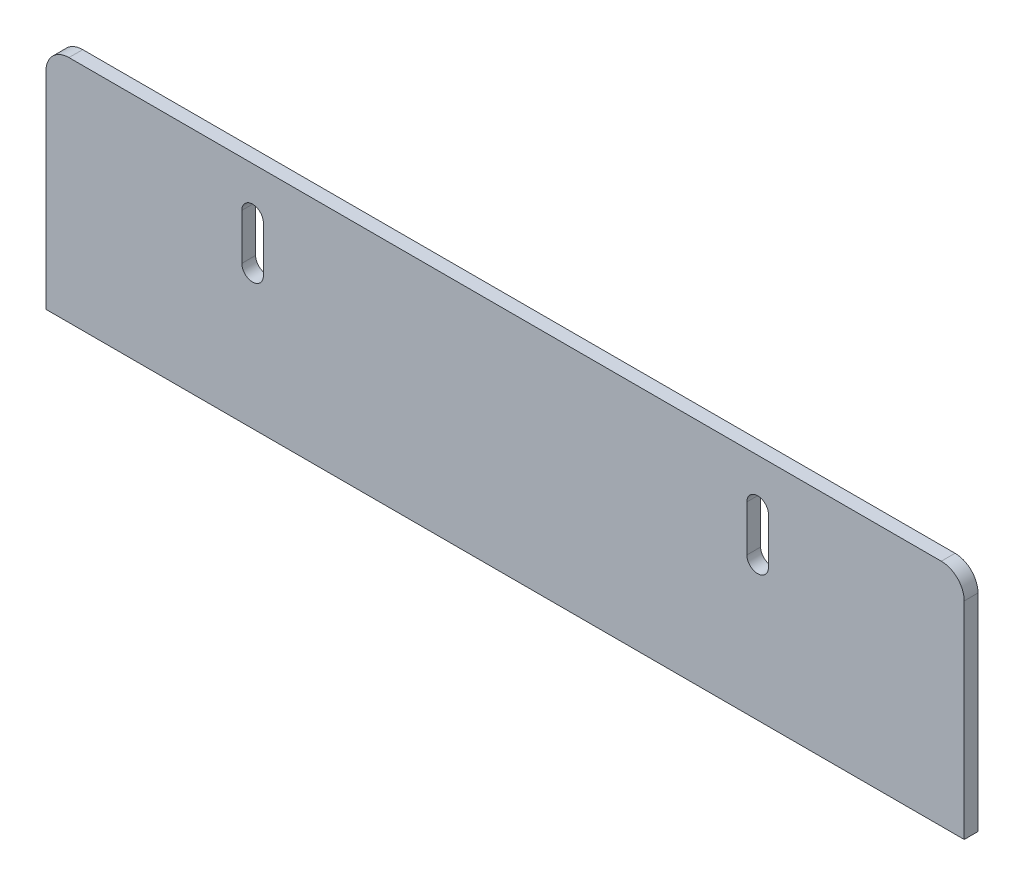
ISO-10303-21;
HEADER;
FILE_DESCRIPTION(('STEP AP214'),'2;1');
FILE_NAME('part.step','',(''),(''),'','','');
FILE_SCHEMA(('AUTOMOTIVE_DESIGN { 1 0 10303 214 1 1 1 1 }'));
ENDSEC;
DATA;
#1=APPLICATION_CONTEXT('core data for automotive mechanical design processes');
#2=APPLICATION_PROTOCOL_DEFINITION('international standard','automotive_design',2000,#1);
#3=PRODUCT_CONTEXT('',#1,'mechanical');
#4=PRODUCT('Part','Part','',(#3));
#5=PRODUCT_RELATED_PRODUCT_CATEGORY('part','',(#4));
#6=PRODUCT_DEFINITION_FORMATION('','',#4);
#7=PRODUCT_DEFINITION_CONTEXT('part definition',#1,'design');
#8=PRODUCT_DEFINITION('design','',#6,#7);
#9=PRODUCT_DEFINITION_SHAPE('','',#8);
#10=(LENGTH_UNIT() NAMED_UNIT(*) SI_UNIT(.MILLI.,.METRE.));
#11=(NAMED_UNIT(*) PLANE_ANGLE_UNIT() SI_UNIT($,.RADIAN.));
#12=(NAMED_UNIT(*) SI_UNIT($,.STERADIAN.) SOLID_ANGLE_UNIT());
#13=UNCERTAINTY_MEASURE_WITH_UNIT(LENGTH_MEASURE(1.E-05),#10,'distance_accuracy_value','');
#14=(GEOMETRIC_REPRESENTATION_CONTEXT(3) GLOBAL_UNCERTAINTY_ASSIGNED_CONTEXT((#13)) GLOBAL_UNIT_ASSIGNED_CONTEXT((#10,
#11,#12)) REPRESENTATION_CONTEXT('',''));
#15=CARTESIAN_POINT('',(0.,0.,0.));
#16=DIRECTION('',(0.,0.,1.));
#17=DIRECTION('',(1.,0.,0.));
#18=AXIS2_PLACEMENT_3D('',#15,#16,#17);
#19=CARTESIAN_POINT('',(45.,30.,3.));
#20=DIRECTION('',(0.,0.,-1.));
#21=DIRECTION('',(-1.,0.,0.));
#22=AXIS2_PLACEMENT_3D('',#19,#20,#21);
#23=CYLINDRICAL_SURFACE('',#22,2.35101433519541);
#24=CARTESIAN_POINT('',(45.,30.,0.));
#25=DIRECTION('',(0.,0.,1.));
#26=DIRECTION('',(1.,0.,0.));
#27=AXIS2_PLACEMENT_3D('',#24,#25,#26);
#28=CIRCLE('',#27,2.35101433519541);
#29=CARTESIAN_POINT('',(42.6489856648046,30.,0.));
#30=VERTEX_POINT('',#29);
#31=CARTESIAN_POINT('',(47.3510143351954,30.,0.));
#32=VERTEX_POINT('',#31);
#33=EDGE_CURVE('E197',#30,#32,#28,.T.);
#34=ORIENTED_EDGE('',*,*,#33,.F.);
#35=DIRECTION('',(0.,0.,-1.));
#36=VECTOR('',#35,1.);
#37=CARTESIAN_POINT('',(42.6489856648046,30.,3.));
#38=LINE('',#37,#36);
#39=CARTESIAN_POINT('',(42.6489856648046,30.,3.));
#40=VERTEX_POINT('',#39);
#41=EDGE_CURVE('E11',#40,#30,#38,.T.);
#42=ORIENTED_EDGE('',*,*,#41,.F.);
#43=CARTESIAN_POINT('',(45.,30.,3.));
#44=DIRECTION('',(0.,0.,1.));
#45=DIRECTION('',(1.,0.,0.));
#46=AXIS2_PLACEMENT_3D('',#43,#44,#45);
#47=CIRCLE('',#46,2.35101433519541);
#48=CARTESIAN_POINT('',(47.3510143351954,30.,3.));
#49=VERTEX_POINT('',#48);
#50=EDGE_CURVE('E161',#40,#49,#47,.T.);
#51=ORIENTED_EDGE('',*,*,#50,.T.);
#52=DIRECTION('',(0.,0.,-1.));
#53=VECTOR('',#52,1.);
#54=CARTESIAN_POINT('',(47.3510143351954,30.,3.));
#55=LINE('',#54,#53);
#56=EDGE_CURVE('E108',#49,#32,#55,.T.);
#57=ORIENTED_EDGE('',*,*,#56,.T.);
#58=EDGE_LOOP('',(#34,#42,#51,#57));
#59=FACE_BOUND('',#58,.T.);
#60=ADVANCED_FACE('F37',(#59),#23,.F.);
#61=CARTESIAN_POINT('',(42.6489856648046,0.,3.));
#62=DIRECTION('',(1.,0.,0.));
#63=DIRECTION('',(0.,0.,-1.));
#64=AXIS2_PLACEMENT_3D('',#61,#62,#63);
#65=PLANE('',#64);
#66=DIRECTION('',(0.,-1.,0.));
#67=VECTOR('',#66,1.);
#68=CARTESIAN_POINT('',(42.6489856648046,0.,0.));
#69=LINE('',#68,#67);
#70=CARTESIAN_POINT('',(42.6489856648046,40.,0.));
#71=VERTEX_POINT('',#70);
#72=EDGE_CURVE('E153',#71,#30,#69,.T.);
#73=ORIENTED_EDGE('',*,*,#72,.F.);
#74=DIRECTION('',(0.,0.,-1.));
#75=VECTOR('',#74,1.);
#76=CARTESIAN_POINT('',(42.6489856648046,40.,3.));
#77=LINE('',#76,#75);
#78=CARTESIAN_POINT('',(42.6489856648046,40.,3.));
#79=VERTEX_POINT('',#78);
#80=EDGE_CURVE('E47',#79,#71,#77,.T.);
#81=ORIENTED_EDGE('',*,*,#80,.F.);
#82=DIRECTION('',(0.,-1.,0.));
#83=VECTOR('',#82,1.);
#84=CARTESIAN_POINT('',(42.6489856648046,0.,3.));
#85=LINE('',#84,#83);
#86=EDGE_CURVE('E151',#79,#40,#85,.T.);
#87=ORIENTED_EDGE('',*,*,#86,.T.);
#88=ORIENTED_EDGE('',*,*,#41,.T.);
#89=EDGE_LOOP('',(#73,#81,#87,#88));
#90=FACE_BOUND('',#89,.T.);
#91=ADVANCED_FACE('F150',(#90),#65,.T.);
#92=CARTESIAN_POINT('',(45.,40.,3.));
#93=DIRECTION('',(0.,0.,-1.));
#94=DIRECTION('',(-1.,0.,0.));
#95=AXIS2_PLACEMENT_3D('',#92,#93,#94);
#96=CYLINDRICAL_SURFACE('',#95,2.35101433519541);
#97=CARTESIAN_POINT('',(45.,40.,0.));
#98=DIRECTION('',(0.,0.,1.));
#99=DIRECTION('',(1.,0.,0.));
#100=AXIS2_PLACEMENT_3D('',#97,#98,#99);
#101=CIRCLE('',#100,2.35101433519541);
#102=CARTESIAN_POINT('',(47.3510143351954,40.,0.));
#103=VERTEX_POINT('',#102);
#104=EDGE_CURVE('E201',#103,#71,#101,.T.);
#105=ORIENTED_EDGE('',*,*,#104,.F.);
#106=DIRECTION('',(0.,0.,-1.));
#107=VECTOR('',#106,1.);
#108=CARTESIAN_POINT('',(47.3510143351954,40.,3.));
#109=LINE('',#108,#107);
#110=CARTESIAN_POINT('',(47.3510143351954,40.,3.));
#111=VERTEX_POINT('',#110);
#112=EDGE_CURVE('E101',#111,#103,#109,.T.);
#113=ORIENTED_EDGE('',*,*,#112,.F.);
#114=CARTESIAN_POINT('',(45.,40.,3.));
#115=DIRECTION('',(0.,0.,1.));
#116=DIRECTION('',(1.,0.,0.));
#117=AXIS2_PLACEMENT_3D('',#114,#115,#116);
#118=CIRCLE('',#117,2.35101433519541);
#119=EDGE_CURVE('E160',#111,#79,#118,.T.);
#120=ORIENTED_EDGE('',*,*,#119,.T.);
#121=ORIENTED_EDGE('',*,*,#80,.T.);
#122=EDGE_LOOP('',(#105,#113,#120,#121));
#123=FACE_BOUND('',#122,.T.);
#124=ADVANCED_FACE('F163',(#123),#96,.F.);
#125=CARTESIAN_POINT('',(0.,50.,3.));
#126=DIRECTION('',(0.,1.,0.));
#127=DIRECTION('',(-1.,0.,0.));
#128=AXIS2_PLACEMENT_3D('',#125,#126,#127);
#129=PLANE('',#128);
#130=DIRECTION('',(1.,0.,0.));
#131=VECTOR('',#130,1.);
#132=CARTESIAN_POINT('',(0.,50.,0.));
#133=LINE('',#132,#131);
#134=CARTESIAN_POINT('',(4.99999999999998,50.,0.));
#135=VERTEX_POINT('',#134);
#136=CARTESIAN_POINT('',(195.,50.,0.));
#137=VERTEX_POINT('',#136);
#138=EDGE_CURVE('E179',#135,#137,#133,.T.);
#139=ORIENTED_EDGE('',*,*,#138,.F.);
#140=DIRECTION('',(0.,0.,-1.));
#141=VECTOR('',#140,1.);
#142=CARTESIAN_POINT('',(4.99999999999998,50.,3.));
#143=LINE('',#142,#141);
#144=CARTESIAN_POINT('',(4.99999999999998,50.,3.));
#145=VERTEX_POINT('',#144);
#146=EDGE_CURVE('E207',#145,#135,#143,.T.);
#147=ORIENTED_EDGE('',*,*,#146,.F.);
#148=DIRECTION('',(1.,0.,0.));
#149=VECTOR('',#148,1.);
#150=CARTESIAN_POINT('',(0.,50.,3.));
#151=LINE('',#150,#149);
#152=CARTESIAN_POINT('',(195.,50.,3.));
#153=VERTEX_POINT('',#152);
#154=EDGE_CURVE('E250',#145,#153,#151,.T.);
#155=ORIENTED_EDGE('',*,*,#154,.T.);
#156=DIRECTION('',(0.,0.,-1.));
#157=VECTOR('',#156,1.);
#158=CARTESIAN_POINT('',(195.,50.,3.));
#159=LINE('',#158,#157);
#160=EDGE_CURVE('E209',#153,#137,#159,.T.);
#161=ORIENTED_EDGE('',*,*,#160,.T.);
#162=EDGE_LOOP('',(#139,#147,#155,#161));
#163=FACE_BOUND('',#162,.T.);
#164=ADVANCED_FACE('F308',(#163),#129,.T.);
#165=CARTESIAN_POINT('',(4.99999999999998,45.,3.));
#166=DIRECTION('',(0.,0.,-1.));
#167=DIRECTION('',(-1.,0.,0.));
#168=AXIS2_PLACEMENT_3D('',#165,#166,#167);
#169=CYLINDRICAL_SURFACE('',#168,4.99999999999999);
#170=CARTESIAN_POINT('',(4.99999999999998,45.,0.));
#171=DIRECTION('',(0.,0.,1.));
#172=DIRECTION('',(1.,0.,0.));
#173=AXIS2_PLACEMENT_3D('',#170,#171,#172);
#174=CIRCLE('',#173,4.99999999999999);
#175=CARTESIAN_POINT('',(0.,45.,0.));
#176=VERTEX_POINT('',#175);
#177=EDGE_CURVE('E182',#176,#135,#174,.F.);
#178=ORIENTED_EDGE('',*,*,#177,.F.);
#179=DIRECTION('',(0.,0.,-1.));
#180=VECTOR('',#179,1.);
#181=CARTESIAN_POINT('',(0.,45.,3.));
#182=LINE('',#181,#180);
#183=CARTESIAN_POINT('',(0.,45.,3.));
#184=VERTEX_POINT('',#183);
#185=EDGE_CURVE('E219',#184,#176,#182,.T.);
#186=ORIENTED_EDGE('',*,*,#185,.F.);
#187=CARTESIAN_POINT('',(4.99999999999998,45.,3.));
#188=DIRECTION('',(0.,0.,1.));
#189=DIRECTION('',(1.,0.,0.));
#190=AXIS2_PLACEMENT_3D('',#187,#188,#189);
#191=CIRCLE('',#190,4.99999999999999);
#192=EDGE_CURVE('E257',#184,#145,#191,.F.);
#193=ORIENTED_EDGE('',*,*,#192,.T.);
#194=ORIENTED_EDGE('',*,*,#146,.T.);
#195=EDGE_LOOP('',(#178,#186,#193,#194));
#196=FACE_BOUND('',#195,.T.);
#197=ADVANCED_FACE('F304',(#196),#169,.T.);
#198=CARTESIAN_POINT('',(0.,0.,3.));
#199=DIRECTION('',(-1.,0.,0.));
#200=DIRECTION('',(0.,0.,1.));
#201=AXIS2_PLACEMENT_3D('',#198,#199,#200);
#202=PLANE('',#201);
#203=DIRECTION('',(0.,1.,0.));
#204=VECTOR('',#203,1.);
#205=CARTESIAN_POINT('',(0.,0.,0.));
#206=LINE('',#205,#204);
#207=CARTESIAN_POINT('',(0.,0.,0.));
#208=VERTEX_POINT('',#207);
#209=EDGE_CURVE('E185',#208,#176,#206,.T.);
#210=ORIENTED_EDGE('',*,*,#209,.F.);
#211=DIRECTION('',(0.,0.,-1.));
#212=VECTOR('',#211,1.);
#213=CARTESIAN_POINT('',(0.,0.,3.));
#214=LINE('',#213,#212);
#215=CARTESIAN_POINT('',(0.,0.,3.));
#216=VERTEX_POINT('',#215);
#217=EDGE_CURVE('E217',#216,#208,#214,.T.);
#218=ORIENTED_EDGE('',*,*,#217,.F.);
#219=DIRECTION('',(0.,1.,0.));
#220=VECTOR('',#219,1.);
#221=CARTESIAN_POINT('',(0.,0.,3.));
#222=LINE('',#221,#220);
#223=EDGE_CURVE('E260',#216,#184,#222,.T.);
#224=ORIENTED_EDGE('',*,*,#223,.T.);
#225=ORIENTED_EDGE('',*,*,#185,.T.);
#226=EDGE_LOOP('',(#210,#218,#224,#225));
#227=FACE_BOUND('',#226,.T.);
#228=ADVANCED_FACE('F300',(#227),#202,.T.);
#229=CARTESIAN_POINT('',(0.,0.,3.));
#230=DIRECTION('',(0.,1.,0.));
#231=DIRECTION('',(-1.,0.,0.));
#232=AXIS2_PLACEMENT_3D('',#229,#230,#231);
#233=PLANE('',#232);
#234=DIRECTION('',(1.,0.,0.));
#235=VECTOR('',#234,1.);
#236=CARTESIAN_POINT('',(0.,0.,0.));
#237=LINE('',#236,#235);
#238=CARTESIAN_POINT('',(200.,0.,0.));
#239=VERTEX_POINT('',#238);
#240=EDGE_CURVE('E188',#208,#239,#237,.T.);
#241=ORIENTED_EDGE('',*,*,#240,.T.);
#242=DIRECTION('',(0.,0.,-1.));
#243=VECTOR('',#242,1.);
#244=CARTESIAN_POINT('',(200.,0.,3.));
#245=LINE('',#244,#243);
#246=CARTESIAN_POINT('',(200.,0.,3.));
#247=VERTEX_POINT('',#246);
#248=EDGE_CURVE('E214',#247,#239,#245,.T.);
#249=ORIENTED_EDGE('',*,*,#248,.F.);
#250=DIRECTION('',(1.,0.,0.));
#251=VECTOR('',#250,1.);
#252=CARTESIAN_POINT('',(0.,0.,3.));
#253=LINE('',#252,#251);
#254=EDGE_CURVE('E263',#216,#247,#253,.T.);
#255=ORIENTED_EDGE('',*,*,#254,.F.);
#256=ORIENTED_EDGE('',*,*,#217,.T.);
#257=EDGE_LOOP('',(#241,#249,#255,#256));
#258=FACE_BOUND('',#257,.T.);
#259=ADVANCED_FACE('F296',(#258),#233,.F.);
#260=CARTESIAN_POINT('',(200.,1.2335811384724E-13,3.));
#261=DIRECTION('',(-1.,0.,0.));
#262=DIRECTION('',(0.,-1.,0.));
#263=AXIS2_PLACEMENT_3D('',#260,#261,#262);
#264=PLANE('',#263);
#265=DIRECTION('',(0.,1.,0.));
#266=VECTOR('',#265,1.);
#267=CARTESIAN_POINT('',(200.,1.2335811384724E-13,0.));
#268=LINE('',#267,#266);
#269=CARTESIAN_POINT('',(200.,45.,0.));
#270=VERTEX_POINT('',#269);
#271=EDGE_CURVE('E191',#239,#270,#268,.T.);
#272=ORIENTED_EDGE('',*,*,#271,.T.);
#273=DIRECTION('',(0.,0.,-1.));
#274=VECTOR('',#273,1.);
#275=CARTESIAN_POINT('',(200.,45.,3.));
#276=LINE('',#275,#274);
#277=CARTESIAN_POINT('',(200.,45.,3.));
#278=VERTEX_POINT('',#277);
#279=EDGE_CURVE('E211',#278,#270,#276,.T.);
#280=ORIENTED_EDGE('',*,*,#279,.F.);
#281=DIRECTION('',(0.,1.,0.));
#282=VECTOR('',#281,1.);
#283=CARTESIAN_POINT('',(200.,1.2335811384724E-13,3.));
#284=LINE('',#283,#282);
#285=EDGE_CURVE('E266',#247,#278,#284,.T.);
#286=ORIENTED_EDGE('',*,*,#285,.F.);
#287=ORIENTED_EDGE('',*,*,#248,.T.);
#288=EDGE_LOOP('',(#272,#280,#286,#287));
#289=FACE_BOUND('',#288,.T.);
#290=ADVANCED_FACE('F293',(#289),#264,.F.);
#291=CARTESIAN_POINT('',(152.648985664805,4.23686046426854E-13,3.));
#292=DIRECTION('',(1.,0.,0.));
#293=DIRECTION('',(0.,1.,0.));
#294=AXIS2_PLACEMENT_3D('',#291,#292,#293);
#295=PLANE('',#294);
#296=DIRECTION('',(0.,-1.,0.));
#297=VECTOR('',#296,1.);
#298=CARTESIAN_POINT('',(152.648985664805,4.23686046426854E-13,0.));
#299=LINE('',#298,#297);
#300=CARTESIAN_POINT('',(152.648985664805,40.,0.));
#301=VERTEX_POINT('',#300);
#302=CARTESIAN_POINT('',(152.648985664805,30.,0.));
#303=VERTEX_POINT('',#302);
#304=EDGE_CURVE('E169',#301,#303,#299,.T.);
#305=ORIENTED_EDGE('',*,*,#304,.F.);
#306=DIRECTION('',(0.,0.,-1.));
#307=VECTOR('',#306,1.);
#308=CARTESIAN_POINT('',(152.648985664805,40.,3.));
#309=LINE('',#308,#307);
#310=CARTESIAN_POINT('',(152.648985664805,40.,3.));
#311=VERTEX_POINT('',#310);
#312=EDGE_CURVE('E41',#311,#301,#309,.T.);
#313=ORIENTED_EDGE('',*,*,#312,.F.);
#314=DIRECTION('',(0.,-1.,0.));
#315=VECTOR('',#314,1.);
#316=CARTESIAN_POINT('',(152.648985664805,4.23686046426854E-13,3.));
#317=LINE('',#316,#315);
#318=CARTESIAN_POINT('',(152.648985664805,30.,3.));
#319=VERTEX_POINT('',#318);
#320=EDGE_CURVE('E205',#311,#319,#317,.T.);
#321=ORIENTED_EDGE('',*,*,#320,.T.);
#322=DIRECTION('',(0.,0.,-1.));
#323=VECTOR('',#322,1.);
#324=CARTESIAN_POINT('',(152.648985664805,30.,3.));
#325=LINE('',#324,#323);
#326=EDGE_CURVE('E165',#319,#303,#325,.T.);
#327=ORIENTED_EDGE('',*,*,#326,.T.);
#328=EDGE_LOOP('',(#305,#313,#321,#327));
#329=FACE_BOUND('',#328,.T.);
#330=ADVANCED_FACE('F39',(#329),#295,.T.);
#331=CARTESIAN_POINT('',(155.,40.,3.));
#332=DIRECTION('',(0.,0.,-1.));
#333=DIRECTION('',(-1.,0.,0.));
#334=AXIS2_PLACEMENT_3D('',#331,#332,#333);
#335=CYLINDRICAL_SURFACE('',#334,2.35101433519541);
#336=CARTESIAN_POINT('',(155.,40.,0.));
#337=DIRECTION('',(0.,0.,1.));
#338=DIRECTION('',(1.,0.,0.));
#339=AXIS2_PLACEMENT_3D('',#336,#337,#338);
#340=CIRCLE('',#339,2.35101433519541);
#341=CARTESIAN_POINT('',(157.351014335195,40.,0.));
#342=VERTEX_POINT('',#341);
#343=EDGE_CURVE('E172',#301,#342,#340,.F.);
#344=ORIENTED_EDGE('',*,*,#343,.T.);
#345=DIRECTION('',(0.,0.,-1.));
#346=VECTOR('',#345,1.);
#347=CARTESIAN_POINT('',(157.351014335195,40.,3.));
#348=LINE('',#347,#346);
#349=CARTESIAN_POINT('',(157.351014335195,40.,3.));
#350=VERTEX_POINT('',#349);
#351=EDGE_CURVE('E225',#350,#342,#348,.T.);
#352=ORIENTED_EDGE('',*,*,#351,.F.);
#353=CARTESIAN_POINT('',(155.,40.,3.));
#354=DIRECTION('',(0.,0.,1.));
#355=DIRECTION('',(1.,0.,0.));
#356=AXIS2_PLACEMENT_3D('',#353,#354,#355);
#357=CIRCLE('',#356,2.35101433519541);
#358=EDGE_CURVE('E234',#311,#350,#357,.F.);
#359=ORIENTED_EDGE('',*,*,#358,.F.);
#360=ORIENTED_EDGE('',*,*,#312,.T.);
#361=EDGE_LOOP('',(#344,#352,#359,#360));
#362=FACE_BOUND('',#361,.T.);
#363=ADVANCED_FACE('F233',(#362),#335,.F.);
#364=CARTESIAN_POINT('',(157.351014335195,4.36736797657643E-13,3.));
#365=DIRECTION('',(1.,0.,0.));
#366=DIRECTION('',(0.,1.,0.));
#367=AXIS2_PLACEMENT_3D('',#364,#365,#366);
#368=PLANE('',#367);
#369=DIRECTION('',(0.,-1.,0.));
#370=VECTOR('',#369,1.);
#371=CARTESIAN_POINT('',(157.351014335195,4.36736797657643E-13,0.));
#372=LINE('',#371,#370);
#373=CARTESIAN_POINT('',(157.351014335195,30.,0.));
#374=VERTEX_POINT('',#373);
#375=EDGE_CURVE('E174',#342,#374,#372,.T.);
#376=ORIENTED_EDGE('',*,*,#375,.T.);
#377=DIRECTION('',(0.,0.,-1.));
#378=VECTOR('',#377,1.);
#379=CARTESIAN_POINT('',(157.351014335195,30.,3.));
#380=LINE('',#379,#378);
#381=CARTESIAN_POINT('',(157.351014335195,30.,3.));
#382=VERTEX_POINT('',#381);
#383=EDGE_CURVE('E223',#382,#374,#380,.T.);
#384=ORIENTED_EDGE('',*,*,#383,.F.);
#385=DIRECTION('',(0.,-1.,0.));
#386=VECTOR('',#385,1.);
#387=CARTESIAN_POINT('',(157.351014335195,4.36736797657643E-13,3.));
#388=LINE('',#387,#386);
#389=EDGE_CURVE('E247',#350,#382,#388,.T.);
#390=ORIENTED_EDGE('',*,*,#389,.F.);
#391=ORIENTED_EDGE('',*,*,#351,.T.);
#392=EDGE_LOOP('',(#376,#384,#390,#391));
#393=FACE_BOUND('',#392,.T.);
#394=ADVANCED_FACE('F246',(#393),#368,.F.);
#395=CARTESIAN_POINT('',(195.,45.,3.));
#396=DIRECTION('',(0.,0.,-1.));
#397=DIRECTION('',(-1.,0.,0.));
#398=AXIS2_PLACEMENT_3D('',#395,#396,#397);
#399=CYLINDRICAL_SURFACE('',#398,4.99999999999999);
#400=CARTESIAN_POINT('',(195.,45.,0.));
#401=DIRECTION('',(0.,0.,1.));
#402=DIRECTION('',(1.,0.,0.));
#403=AXIS2_PLACEMENT_3D('',#400,#401,#402);
#404=CIRCLE('',#403,4.99999999999999);
#405=EDGE_CURVE('E194',#270,#137,#404,.T.);
#406=ORIENTED_EDGE('',*,*,#405,.T.);
#407=ORIENTED_EDGE('',*,*,#160,.F.);
#408=CARTESIAN_POINT('',(195.,45.,3.));
#409=DIRECTION('',(0.,0.,1.));
#410=DIRECTION('',(1.,0.,0.));
#411=AXIS2_PLACEMENT_3D('',#408,#409,#410);
#412=CIRCLE('',#411,4.99999999999999);
#413=EDGE_CURVE('E269',#278,#153,#412,.T.);
#414=ORIENTED_EDGE('',*,*,#413,.F.);
#415=ORIENTED_EDGE('',*,*,#279,.T.);
#416=EDGE_LOOP('',(#406,#407,#414,#415));
#417=FACE_BOUND('',#416,.T.);
#418=ADVANCED_FACE('F279',(#417),#399,.T.);
#419=CARTESIAN_POINT('',(155.,30.,3.));
#420=DIRECTION('',(0.,0.,-1.));
#421=DIRECTION('',(-1.,0.,0.));
#422=AXIS2_PLACEMENT_3D('',#419,#420,#421);
#423=CYLINDRICAL_SURFACE('',#422,2.35101433519541);
#424=CARTESIAN_POINT('',(155.,30.,0.));
#425=DIRECTION('',(0.,0.,1.));
#426=DIRECTION('',(1.,0.,0.));
#427=AXIS2_PLACEMENT_3D('',#424,#425,#426);
#428=CIRCLE('',#427,2.35101433519541);
#429=EDGE_CURVE('E176',#374,#303,#428,.F.);
#430=ORIENTED_EDGE('',*,*,#429,.T.);
#431=ORIENTED_EDGE('',*,*,#326,.F.);
#432=CARTESIAN_POINT('',(155.,30.,3.));
#433=DIRECTION('',(0.,0.,1.));
#434=DIRECTION('',(1.,0.,0.));
#435=AXIS2_PLACEMENT_3D('',#432,#433,#434);
#436=CIRCLE('',#435,2.35101433519541);
#437=EDGE_CURVE('E245',#382,#319,#436,.F.);
#438=ORIENTED_EDGE('',*,*,#437,.F.);
#439=ORIENTED_EDGE('',*,*,#383,.T.);
#440=EDGE_LOOP('',(#430,#431,#438,#439));
#441=FACE_BOUND('',#440,.T.);
#442=ADVANCED_FACE('F243',(#441),#423,.F.);
#443=CARTESIAN_POINT('',(47.3510143351954,0.,3.));
#444=DIRECTION('',(1.,0.,0.));
#445=DIRECTION('',(0.,0.,-1.));
#446=AXIS2_PLACEMENT_3D('',#443,#444,#445);
#447=PLANE('',#446);
#448=DIRECTION('',(0.,-1.,0.));
#449=VECTOR('',#448,1.);
#450=CARTESIAN_POINT('',(47.3510143351954,0.,0.));
#451=LINE('',#450,#449);
#452=EDGE_CURVE('E203',#103,#32,#451,.T.);
#453=ORIENTED_EDGE('',*,*,#452,.T.);
#454=ORIENTED_EDGE('',*,*,#56,.F.);
#455=DIRECTION('',(0.,-1.,0.));
#456=VECTOR('',#455,1.);
#457=CARTESIAN_POINT('',(47.3510143351954,0.,3.));
#458=LINE('',#457,#456);
#459=EDGE_CURVE('E56',#111,#49,#458,.T.);
#460=ORIENTED_EDGE('',*,*,#459,.F.);
#461=ORIENTED_EDGE('',*,*,#112,.T.);
#462=EDGE_LOOP('',(#453,#454,#460,#461));
#463=FACE_BOUND('',#462,.T.);
#464=ADVANCED_FACE('F271',(#463),#447,.F.);
#465=CARTESIAN_POINT('',(0.,0.,3.));
#466=DIRECTION('',(0.,0.,1.));
#467=DIRECTION('',(1.,0.,0.));
#468=AXIS2_PLACEMENT_3D('',#465,#466,#467);
#469=PLANE('',#468);
#470=ORIENTED_EDGE('',*,*,#320,.F.);
#471=ORIENTED_EDGE('',*,*,#358,.T.);
#472=ORIENTED_EDGE('',*,*,#389,.T.);
#473=ORIENTED_EDGE('',*,*,#437,.T.);
#474=EDGE_LOOP('',(#470,#471,#472,#473));
#475=FACE_BOUND('',#474,.T.);
#476=ORIENTED_EDGE('',*,*,#154,.F.);
#477=ORIENTED_EDGE('',*,*,#192,.F.);
#478=ORIENTED_EDGE('',*,*,#223,.F.);
#479=ORIENTED_EDGE('',*,*,#254,.T.);
#480=ORIENTED_EDGE('',*,*,#285,.T.);
#481=ORIENTED_EDGE('',*,*,#413,.T.);
#482=EDGE_LOOP('',(#476,#477,#478,#479,#480,#481));
#483=FACE_BOUND('',#482,.T.);
#484=ORIENTED_EDGE('',*,*,#50,.F.);
#485=ORIENTED_EDGE('',*,*,#86,.F.);
#486=ORIENTED_EDGE('',*,*,#119,.F.);
#487=ORIENTED_EDGE('',*,*,#459,.T.);
#488=EDGE_LOOP('',(#484,#485,#486,#487));
#489=FACE_BOUND('',#488,.T.);
#490=ADVANCED_FACE('F159',(#475,#483,#489),#469,.T.);
#491=CARTESIAN_POINT('',(0.,0.,0.));
#492=DIRECTION('',(0.,0.,1.));
#493=DIRECTION('',(1.,0.,0.));
#494=AXIS2_PLACEMENT_3D('',#491,#492,#493);
#495=PLANE('',#494);
#496=ORIENTED_EDGE('',*,*,#304,.T.);
#497=ORIENTED_EDGE('',*,*,#429,.F.);
#498=ORIENTED_EDGE('',*,*,#375,.F.);
#499=ORIENTED_EDGE('',*,*,#343,.F.);
#500=EDGE_LOOP('',(#496,#497,#498,#499));
#501=FACE_BOUND('',#500,.T.);
#502=ORIENTED_EDGE('',*,*,#138,.T.);
#503=ORIENTED_EDGE('',*,*,#405,.F.);
#504=ORIENTED_EDGE('',*,*,#271,.F.);
#505=ORIENTED_EDGE('',*,*,#240,.F.);
#506=ORIENTED_EDGE('',*,*,#209,.T.);
#507=ORIENTED_EDGE('',*,*,#177,.T.);
#508=EDGE_LOOP('',(#502,#503,#504,#505,#506,#507));
#509=FACE_BOUND('',#508,.T.);
#510=ORIENTED_EDGE('',*,*,#33,.T.);
#511=ORIENTED_EDGE('',*,*,#452,.F.);
#512=ORIENTED_EDGE('',*,*,#104,.T.);
#513=ORIENTED_EDGE('',*,*,#72,.T.);
#514=EDGE_LOOP('',(#510,#511,#512,#513));
#515=FACE_BOUND('',#514,.T.);
#516=ADVANCED_FACE('F237',(#501,#509,#515),#495,.F.);
#517=CLOSED_SHELL('',(#60,#91,#124,#164,#197,#228,#259,#290,#330,#363,#394,#418,#442,#464,#490,#516));
#518=MANIFOLD_SOLID_BREP('B2',#517);
#519=ADVANCED_BREP_SHAPE_REPRESENTATION('',(#18,#518),#14);
#520=SHAPE_DEFINITION_REPRESENTATION(#9,#519);
ENDSEC;
END-ISO-10303-21;
